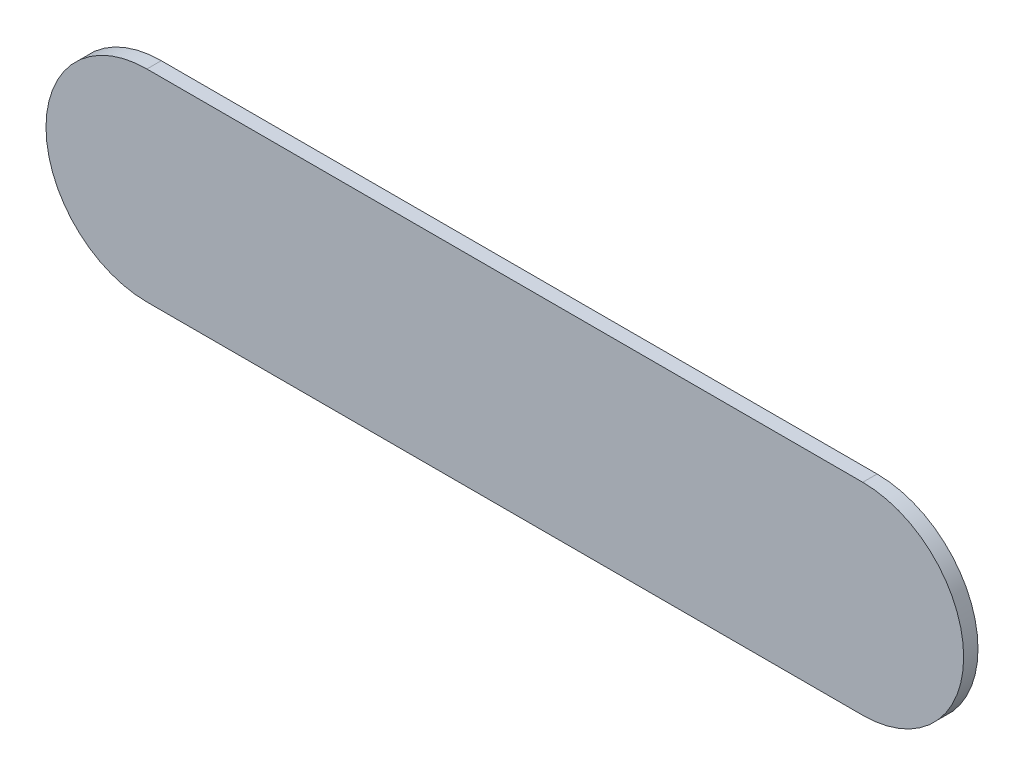
ISO-10303-21;
HEADER;
FILE_DESCRIPTION(('STEP AP214'),'2;1');
FILE_NAME('part.step','',(''),(''),'','','');
FILE_SCHEMA(('AUTOMOTIVE_DESIGN { 1 0 10303 214 1 1 1 1 }'));
ENDSEC;
DATA;
#1=APPLICATION_CONTEXT('core data for automotive mechanical design processes');
#2=APPLICATION_PROTOCOL_DEFINITION('international standard','automotive_design',2000,#1);
#3=PRODUCT_CONTEXT('',#1,'mechanical');
#4=PRODUCT('Part','Part','',(#3));
#5=PRODUCT_RELATED_PRODUCT_CATEGORY('part','',(#4));
#6=PRODUCT_DEFINITION_FORMATION('','',#4);
#7=PRODUCT_DEFINITION_CONTEXT('part definition',#1,'design');
#8=PRODUCT_DEFINITION('design','',#6,#7);
#9=PRODUCT_DEFINITION_SHAPE('','',#8);
#10=(LENGTH_UNIT() NAMED_UNIT(*) SI_UNIT(.MILLI.,.METRE.));
#11=(NAMED_UNIT(*) PLANE_ANGLE_UNIT() SI_UNIT($,.RADIAN.));
#12=(NAMED_UNIT(*) SI_UNIT($,.STERADIAN.) SOLID_ANGLE_UNIT());
#13=UNCERTAINTY_MEASURE_WITH_UNIT(LENGTH_MEASURE(1.E-05),#10,'distance_accuracy_value','');
#14=(GEOMETRIC_REPRESENTATION_CONTEXT(3) GLOBAL_UNCERTAINTY_ASSIGNED_CONTEXT((#13)) GLOBAL_UNIT_ASSIGNED_CONTEXT((#10,
#11,#12)) REPRESENTATION_CONTEXT('',''));
#15=CARTESIAN_POINT('',(0.,0.,0.));
#16=DIRECTION('',(0.,0.,1.));
#17=DIRECTION('',(1.,0.,0.));
#18=AXIS2_PLACEMENT_3D('',#15,#16,#17);
#19=CARTESIAN_POINT('',(92.54500414,107.90401076,0.));
#20=DIRECTION('',(0.,1.,0.));
#21=DIRECTION('',(1.,0.,0.));
#22=AXIS2_PLACEMENT_3D('',#19,#20,#21);
#23=PLANE('',#22);
#24=DIRECTION('',(1.,0.,0.));
#25=VECTOR('',#24,1.);
#26=CARTESIAN_POINT('',(92.54500414,107.90401076,0.03556));
#27=LINE('',#26,#25);
#28=CARTESIAN_POINT('',(92.54500414,107.90401076,0.03556));
#29=VERTEX_POINT('',#28);
#30=CARTESIAN_POINT('',(94.3184296,107.90401076,0.03556));
#31=VERTEX_POINT('',#30);
#32=EDGE_CURVE('E11',#29,#31,#27,.T.);
#33=ORIENTED_EDGE('',*,*,#32,.F.);
#34=DIRECTION('',(0.,0.,1.));
#35=VECTOR('',#34,1.);
#36=CARTESIAN_POINT('',(92.54500414,107.90401076,0.));
#37=LINE('',#36,#35);
#38=CARTESIAN_POINT('',(92.54500414,107.90401076,0.));
#39=VERTEX_POINT('',#38);
#40=EDGE_CURVE('E24',#39,#29,#37,.T.);
#41=ORIENTED_EDGE('',*,*,#40,.F.);
#42=DIRECTION('',(1.,0.,0.));
#43=VECTOR('',#42,1.);
#44=CARTESIAN_POINT('',(92.54500414,107.90401076,0.));
#45=LINE('',#44,#43);
#46=CARTESIAN_POINT('',(94.3184296,107.90401076,0.));
#47=VERTEX_POINT('',#46);
#48=EDGE_CURVE('E75',#39,#47,#45,.T.);
#49=ORIENTED_EDGE('',*,*,#48,.T.);
#50=DIRECTION('',(0.,0.,1.));
#51=VECTOR('',#50,1.);
#52=CARTESIAN_POINT('',(94.3184296,107.90401076,0.));
#53=LINE('',#52,#51);
#54=EDGE_CURVE('E37',#47,#31,#53,.T.);
#55=ORIENTED_EDGE('',*,*,#54,.T.);
#56=EDGE_LOOP('',(#33,#41,#49,#55));
#57=FACE_BOUND('',#56,.T.);
#58=ADVANCED_FACE('F17',(#57),#23,.F.);
#59=CARTESIAN_POINT('',(94.3184296,108.15401026,0.));
#60=DIRECTION('',(0.,0.,-1.));
#61=DIRECTION('',(0.,-1.,0.));
#62=AXIS2_PLACEMENT_3D('',#59,#60,#61);
#63=CYLINDRICAL_SURFACE('',#62,0.249999499999992);
#64=CARTESIAN_POINT('',(94.3184296,108.15401026,0.03556));
#65=DIRECTION('',(0.,0.,1.));
#66=DIRECTION('',(0.,-1.,0.));
#67=AXIS2_PLACEMENT_3D('',#64,#65,#66);
#68=CIRCLE('',#67,0.249999499999992);
#69=CARTESIAN_POINT('',(94.3184296,108.40400976,0.03556));
#70=VERTEX_POINT('',#69);
#71=EDGE_CURVE('E83',#31,#70,#68,.T.);
#72=ORIENTED_EDGE('',*,*,#71,.F.);
#73=ORIENTED_EDGE('',*,*,#54,.F.);
#74=CARTESIAN_POINT('',(94.3184296,108.15401026,0.));
#75=DIRECTION('',(0.,0.,1.));
#76=DIRECTION('',(0.,-1.,0.));
#77=AXIS2_PLACEMENT_3D('',#74,#75,#76);
#78=CIRCLE('',#77,0.249999499999992);
#79=CARTESIAN_POINT('',(94.3184296,108.40400976,0.));
#80=VERTEX_POINT('',#79);
#81=EDGE_CURVE('E81',#47,#80,#78,.T.);
#82=ORIENTED_EDGE('',*,*,#81,.T.);
#83=DIRECTION('',(0.,0.,1.));
#84=VECTOR('',#83,1.);
#85=CARTESIAN_POINT('',(94.3184296,108.40400976,0.));
#86=LINE('',#85,#84);
#87=EDGE_CURVE('E67',#80,#70,#86,.T.);
#88=ORIENTED_EDGE('',*,*,#87,.T.);
#89=EDGE_LOOP('',(#72,#73,#82,#88));
#90=FACE_BOUND('',#89,.T.);
#91=ADVANCED_FACE('F89',(#90),#63,.T.);
#92=CARTESIAN_POINT('',(94.3184296,108.40400976,0.));
#93=DIRECTION('',(0.,-1.,0.));
#94=DIRECTION('',(-1.,0.,0.));
#95=AXIS2_PLACEMENT_3D('',#92,#93,#94);
#96=PLANE('',#95);
#97=DIRECTION('',(-1.,0.,0.));
#98=VECTOR('',#97,1.);
#99=CARTESIAN_POINT('',(94.3184296,108.40400976,0.03556));
#100=LINE('',#99,#98);
#101=CARTESIAN_POINT('',(92.54500414,108.40400976,0.03556));
#102=VERTEX_POINT('',#101);
#103=EDGE_CURVE('E71',#70,#102,#100,.T.);
#104=ORIENTED_EDGE('',*,*,#103,.F.);
#105=ORIENTED_EDGE('',*,*,#87,.F.);
#106=DIRECTION('',(-1.,0.,0.));
#107=VECTOR('',#106,1.);
#108=CARTESIAN_POINT('',(94.3184296,108.40400976,0.));
#109=LINE('',#108,#107);
#110=CARTESIAN_POINT('',(92.54500414,108.40400976,0.));
#111=VERTEX_POINT('',#110);
#112=EDGE_CURVE('E63',#80,#111,#109,.T.);
#113=ORIENTED_EDGE('',*,*,#112,.T.);
#114=DIRECTION('',(0.,0.,1.));
#115=VECTOR('',#114,1.);
#116=CARTESIAN_POINT('',(92.54500414,108.40400976,0.));
#117=LINE('',#116,#115);
#118=EDGE_CURVE('E53',#111,#102,#117,.T.);
#119=ORIENTED_EDGE('',*,*,#118,.T.);
#120=EDGE_LOOP('',(#104,#105,#113,#119));
#121=FACE_BOUND('',#120,.T.);
#122=ADVANCED_FACE('F66',(#121),#96,.F.);
#123=CARTESIAN_POINT('',(92.54500414,108.15401026,0.));
#124=DIRECTION('',(0.,0.,-1.));
#125=DIRECTION('',(0.,1.,0.));
#126=AXIS2_PLACEMENT_3D('',#123,#124,#125);
#127=CYLINDRICAL_SURFACE('',#126,0.249999499999992);
#128=CARTESIAN_POINT('',(92.54500414,108.15401026,0.03556));
#129=DIRECTION('',(0.,0.,1.));
#130=DIRECTION('',(0.,1.,0.));
#131=AXIS2_PLACEMENT_3D('',#128,#129,#130);
#132=CIRCLE('',#131,0.249999499999992);
#133=EDGE_CURVE('E59',#102,#29,#132,.T.);
#134=ORIENTED_EDGE('',*,*,#133,.F.);
#135=ORIENTED_EDGE('',*,*,#118,.F.);
#136=CARTESIAN_POINT('',(92.54500414,108.15401026,0.));
#137=DIRECTION('',(0.,0.,1.));
#138=DIRECTION('',(0.,1.,0.));
#139=AXIS2_PLACEMENT_3D('',#136,#137,#138);
#140=CIRCLE('',#139,0.249999499999992);
#141=EDGE_CURVE('E57',#111,#39,#140,.T.);
#142=ORIENTED_EDGE('',*,*,#141,.T.);
#143=ORIENTED_EDGE('',*,*,#40,.T.);
#144=EDGE_LOOP('',(#134,#135,#142,#143));
#145=FACE_BOUND('',#144,.T.);
#146=ADVANCED_FACE('F55',(#145),#127,.T.);
#147=CARTESIAN_POINT('',(92.54500414,107.90401076,0.));
#148=DIRECTION('',(0.,0.,-1.));
#149=DIRECTION('',(-1.,0.,0.));
#150=AXIS2_PLACEMENT_3D('',#147,#148,#149);
#151=PLANE('',#150);
#152=ORIENTED_EDGE('',*,*,#141,.F.);
#153=ORIENTED_EDGE('',*,*,#112,.F.);
#154=ORIENTED_EDGE('',*,*,#81,.F.);
#155=ORIENTED_EDGE('',*,*,#48,.F.);
#156=EDGE_LOOP('',(#152,#153,#154,#155));
#157=FACE_BOUND('',#156,.T.);
#158=ADVANCED_FACE('F74',(#157),#151,.T.);
#159=CARTESIAN_POINT('',(92.54500414,107.90401076,0.03556));
#160=DIRECTION('',(0.,0.,-1.));
#161=DIRECTION('',(-1.,0.,0.));
#162=AXIS2_PLACEMENT_3D('',#159,#160,#161);
#163=PLANE('',#162);
#164=ORIENTED_EDGE('',*,*,#32,.T.);
#165=ORIENTED_EDGE('',*,*,#71,.T.);
#166=ORIENTED_EDGE('',*,*,#103,.T.);
#167=ORIENTED_EDGE('',*,*,#133,.T.);
#168=EDGE_LOOP('',(#164,#165,#166,#167));
#169=FACE_BOUND('',#168,.T.);
#170=ADVANCED_FACE('F91',(#169),#163,.F.);
#171=CLOSED_SHELL('',(#58,#91,#122,#146,#158,#170));
#172=MANIFOLD_SOLID_BREP('B1',#171);
#173=ADVANCED_BREP_SHAPE_REPRESENTATION('',(#18,#172),#14);
#174=SHAPE_DEFINITION_REPRESENTATION(#9,#173);
ENDSEC;
END-ISO-10303-21;
